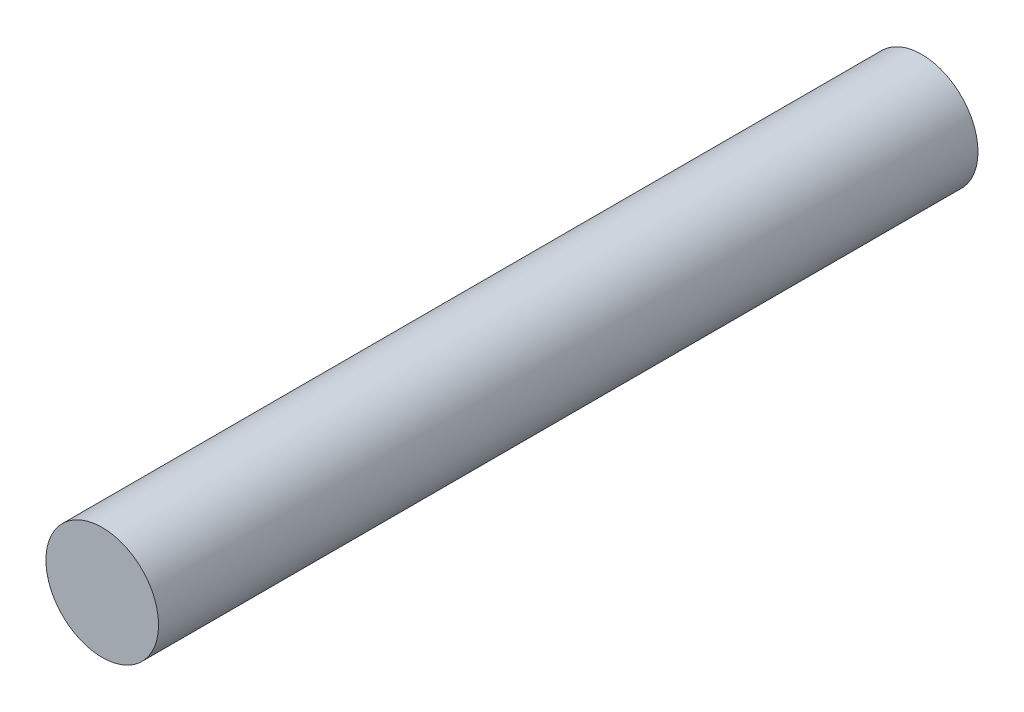
ISO-10303-21;
HEADER;
FILE_DESCRIPTION(('STEP AP214'),'2;1');
FILE_NAME('part.step','',(''),(''),'','','');
FILE_SCHEMA(('AUTOMOTIVE_DESIGN { 1 0 10303 214 1 1 1 1 }'));
ENDSEC;
DATA;
#1=APPLICATION_CONTEXT('core data for automotive mechanical design processes');
#2=APPLICATION_PROTOCOL_DEFINITION('international standard','automotive_design',2000,#1);
#3=PRODUCT_CONTEXT('',#1,'mechanical');
#4=PRODUCT('Part','Part','',(#3));
#5=PRODUCT_RELATED_PRODUCT_CATEGORY('part','',(#4));
#6=PRODUCT_DEFINITION_FORMATION('','',#4);
#7=PRODUCT_DEFINITION_CONTEXT('part definition',#1,'design');
#8=PRODUCT_DEFINITION('design','',#6,#7);
#9=PRODUCT_DEFINITION_SHAPE('','',#8);
#10=(LENGTH_UNIT() NAMED_UNIT(*) SI_UNIT(.MILLI.,.METRE.));
#11=(NAMED_UNIT(*) PLANE_ANGLE_UNIT() SI_UNIT($,.RADIAN.));
#12=(NAMED_UNIT(*) SI_UNIT($,.STERADIAN.) SOLID_ANGLE_UNIT());
#13=UNCERTAINTY_MEASURE_WITH_UNIT(LENGTH_MEASURE(1.E-05),#10,'distance_accuracy_value','');
#14=(GEOMETRIC_REPRESENTATION_CONTEXT(3) GLOBAL_UNCERTAINTY_ASSIGNED_CONTEXT((#13)) GLOBAL_UNIT_ASSIGNED_CONTEXT((#10,
#11,#12)) REPRESENTATION_CONTEXT('',''));
#15=CARTESIAN_POINT('',(0.,0.,0.));
#16=DIRECTION('',(0.,0.,1.));
#17=DIRECTION('',(1.,0.,0.));
#18=AXIS2_PLACEMENT_3D('',#15,#16,#17);
#19=CARTESIAN_POINT('',(0.,0.,160.));
#20=DIRECTION('',(0.,0.,-1.));
#21=DIRECTION('',(-1.,0.,0.));
#22=AXIS2_PLACEMENT_3D('',#19,#20,#21);
#23=CYLINDRICAL_SURFACE('',#22,10.9995);
#24=CARTESIAN_POINT('',(0.,0.,160.));
#25=DIRECTION('',(0.,0.,1.));
#26=DIRECTION('',(1.,0.,0.));
#27=AXIS2_PLACEMENT_3D('',#24,#25,#26);
#28=CIRCLE('',#27,10.9995);
#29=CARTESIAN_POINT('',(10.9995,0.,160.));
#30=VERTEX_POINT('',#29);
#31=EDGE_CURVE('E10',#30,#30,#28,.T.);
#32=ORIENTED_EDGE('',*,*,#31,.F.);
#33=EDGE_LOOP('',(#32));
#34=FACE_BOUND('',#33,.T.);
#35=CARTESIAN_POINT('',(0.,0.,0.));
#36=DIRECTION('',(0.,0.,1.));
#37=DIRECTION('',(1.,0.,0.));
#38=AXIS2_PLACEMENT_3D('',#35,#36,#37);
#39=CIRCLE('',#38,10.9995);
#40=CARTESIAN_POINT('',(10.9995,0.,0.));
#41=VERTEX_POINT('',#40);
#42=EDGE_CURVE('E38',#41,#41,#39,.T.);
#43=ORIENTED_EDGE('',*,*,#42,.T.);
#44=EDGE_LOOP('',(#43));
#45=FACE_BOUND('',#44,.T.);
#46=ADVANCED_FACE('F35',(#34,#45),#23,.T.);
#47=CARTESIAN_POINT('',(0.,0.,160.));
#48=DIRECTION('',(0.,0.,1.));
#49=DIRECTION('',(1.,0.,0.));
#50=AXIS2_PLACEMENT_3D('',#47,#48,#49);
#51=PLANE('',#50);
#52=ORIENTED_EDGE('',*,*,#31,.T.);
#53=EDGE_LOOP('',(#52));
#54=FACE_BOUND('',#53,.T.);
#55=ADVANCED_FACE('F50',(#54),#51,.T.);
#56=CARTESIAN_POINT('',(0.,0.,0.));
#57=DIRECTION('',(0.,0.,1.));
#58=DIRECTION('',(1.,0.,0.));
#59=AXIS2_PLACEMENT_3D('',#56,#57,#58);
#60=PLANE('',#59);
#61=ORIENTED_EDGE('',*,*,#42,.F.);
#62=EDGE_LOOP('',(#61));
#63=FACE_BOUND('',#62,.T.);
#64=ADVANCED_FACE('F48',(#63),#60,.F.);
#65=CLOSED_SHELL('',(#46,#55,#64));
#66=MANIFOLD_SOLID_BREP('B2',#65);
#67=ADVANCED_BREP_SHAPE_REPRESENTATION('',(#18,#66),#14);
#68=SHAPE_DEFINITION_REPRESENTATION(#9,#67);
ENDSEC;
END-ISO-10303-21;
